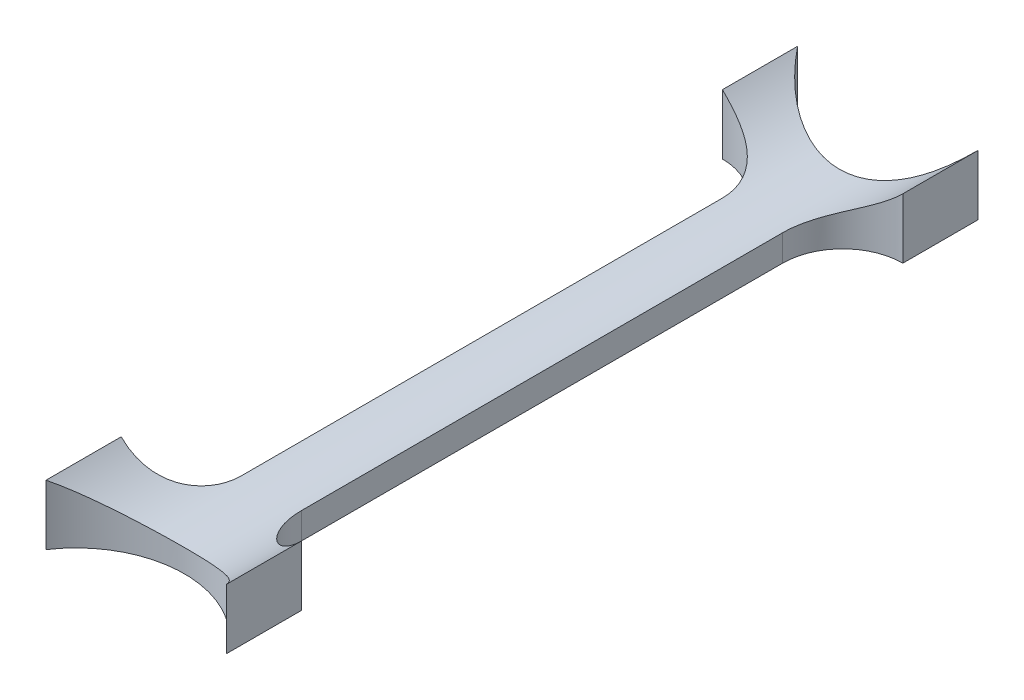
ISO-10303-21;
HEADER;
FILE_DESCRIPTION(('STEP AP214'),'2;1');
FILE_NAME('part.step','',(''),(''),'','','');
FILE_SCHEMA(('AUTOMOTIVE_DESIGN { 1 0 10303 214 1 1 1 1 }'));
ENDSEC;
DATA;
#1=APPLICATION_CONTEXT('core data for automotive mechanical design processes');
#2=APPLICATION_PROTOCOL_DEFINITION('international standard','automotive_design',2000,#1);
#3=PRODUCT_CONTEXT('',#1,'mechanical');
#4=PRODUCT('Part','Part','',(#3));
#5=PRODUCT_RELATED_PRODUCT_CATEGORY('part','',(#4));
#6=PRODUCT_DEFINITION_FORMATION('','',#4);
#7=PRODUCT_DEFINITION_CONTEXT('part definition',#1,'design');
#8=PRODUCT_DEFINITION('design','',#6,#7);
#9=PRODUCT_DEFINITION_SHAPE('','',#8);
#10=(LENGTH_UNIT() NAMED_UNIT(*) SI_UNIT(.MILLI.,.METRE.));
#11=(NAMED_UNIT(*) PLANE_ANGLE_UNIT() SI_UNIT($,.RADIAN.));
#12=(NAMED_UNIT(*) SI_UNIT($,.STERADIAN.) SOLID_ANGLE_UNIT());
#13=UNCERTAINTY_MEASURE_WITH_UNIT(LENGTH_MEASURE(1.E-05),#10,'distance_accuracy_value','');
#14=(GEOMETRIC_REPRESENTATION_CONTEXT(3) GLOBAL_UNCERTAINTY_ASSIGNED_CONTEXT((#13)) GLOBAL_UNIT_ASSIGNED_CONTEXT((#10,
#11,#12)) REPRESENTATION_CONTEXT('',''));
#15=CARTESIAN_POINT('',(0.,0.,0.));
#16=DIRECTION('',(0.,0.,1.));
#17=DIRECTION('',(1.,0.,0.));
#18=AXIS2_PLACEMENT_3D('',#15,#16,#17);
#19=CARTESIAN_POINT('',(0.,10.,72.4999999999999));
#20=DIRECTION('',(0.,-1.,0.));
#21=DIRECTION('',(0.,0.,-1.));
#22=AXIS2_PLACEMENT_3D('',#19,#20,#21);
#23=CYLINDRICAL_SURFACE('',#22,18.0277563773199);
#24=DIRECTION('',(0.,-1.,0.));
#25=VECTOR('',#24,1.);
#26=CARTESIAN_POINT('',(15.,10.,62.5));
#27=LINE('',#26,#25);
#28=CARTESIAN_POINT('',(15.,10.,62.5));
#29=VERTEX_POINT('',#28);
#30=CARTESIAN_POINT('',(15.,0.,62.5));
#31=VERTEX_POINT('',#30);
#32=EDGE_CURVE('E11',#29,#31,#27,.T.);
#33=ORIENTED_EDGE('',*,*,#32,.F.);
#34=CARTESIAN_POINT('',(15.,10.0000000000001,62.4999999999999));
#35=CARTESIAN_POINT('',(14.8538122564849,9.85380413927755,62.2807379878146));
#36=CARTESIAN_POINT('',(14.7029530143159,9.70722716261272,62.064847365456));
#37=CARTESIAN_POINT('',(14.3918877210769,9.41413551974458,61.6398422916655));
#38=CARTESIAN_POINT('',(14.2316811865237,9.26762085715996,61.4307281916172));
#39=CARTESIAN_POINT('',(13.9017278512085,8.97531227531786,61.0190767772544));
#40=CARTESIAN_POINT('',(13.7319694480602,8.82951947729172,60.8165479542715));
#41=CARTESIAN_POINT('',(13.3830971970355,8.53961843121481,60.4184954744921));
#42=CARTESIAN_POINT('',(13.2039834739119,8.39551016073229,60.2229717243419));
#43=CARTESIAN_POINT('',(12.6492620449402,7.96424982710555,59.6437252609932));
#44=CARTESIAN_POINT('',(12.2591722953751,7.68075854553667,59.270953322517));
#45=CARTESIAN_POINT('',(11.4409021588635,7.12966244429384,58.5572511710102));
#46=CARTESIAN_POINT('',(11.0127426844714,6.86204903562067,58.216303684527));
#47=CARTESIAN_POINT('',(10.2157817183783,6.40428397178129,57.639843567146));
#48=CARTESIAN_POINT('',(9.85430584667956,6.2099384539669,57.3975215085808));
#49=CARTESIAN_POINT('',(9.10864141577833,5.837372166692,56.9364283524844));
#50=CARTESIAN_POINT('',(8.72445316377304,5.65915117922095,56.7176569365309));
#51=CARTESIAN_POINT('',(7.9357087555652,5.32240437427608,56.3067428775596));
#52=CARTESIAN_POINT('',(7.53122728922545,5.16381285186149,56.1145111353261));
#53=CARTESIAN_POINT('',(6.70225837838313,4.86860170963907,55.7583416016792));
#54=CARTESIAN_POINT('',(6.27777411760969,4.73197860841615,55.5943993268298));
#55=CARTESIAN_POINT('',(5.47555326492917,4.50205800257936,55.3194756106261));
#56=CARTESIAN_POINT('',(5.10025032923467,4.40533898433433,55.2042439885879));
#57=CARTESIAN_POINT('',(4.33866847318943,4.2315517049285,54.9976696868578));
#58=CARTESIAN_POINT('',(3.95239058653091,4.15448159987982,54.9063247655761));
#59=CARTESIAN_POINT('',(3.17107571026853,4.02140779489103,54.7488562658861));
#60=CARTESIAN_POINT('',(2.77603745740434,3.9654071543996,54.6827363503236));
#61=CARTESIAN_POINT('',(1.97992934674089,3.87559879026633,54.5767994702944));
#62=CARTESIAN_POINT('',(1.57885941630988,3.84179133408773,54.536982822824));
#63=CARTESIAN_POINT('',(0.77270065832343,3.79702164151102,54.4842711439706));
#64=CARTESIAN_POINT('',(0.367604473815429,3.78611466798966,54.4714412361838));
#65=CARTESIAN_POINT('',(-0.442489980262146,3.78754454988629,54.473123775996));
#66=CARTESIAN_POINT('',(-0.847488249773488,3.7998814190943,54.4876362398165));
#67=CARTESIAN_POINT('',(-1.65422725750526,3.84753401334125,54.5437466119855));
#68=CARTESIAN_POINT('',(-2.05596802040053,3.88284956415713,54.5853443149751));
#69=CARTESIAN_POINT('',(-2.85321266721823,3.97572254147166,54.6949140149562));
#70=CARTESIAN_POINT('',(-3.24871657622131,4.03327987850427,54.7628859058593));
#71=CARTESIAN_POINT('',(-4.01620788650184,4.16694633052809,54.9210965969079));
#72=CARTESIAN_POINT('',(-4.38852217373119,4.24228331219802,55.0104101853058));
#73=CARTESIAN_POINT('',(-5.12283285610097,4.41120383005804,55.2112326727065));
#74=CARTESIAN_POINT('',(-5.48482976496761,4.50478645592952,55.3227404643934));
#75=CARTESIAN_POINT('',(-6.19693417926346,4.70874040364197,55.5666103016444));
#76=CARTESIAN_POINT('',(-6.54703913531731,4.81911529793729,55.6989767849849));
#77=CARTESIAN_POINT('',(-7.23402672218851,5.05505481834684,55.9831267649931));
#78=CARTESIAN_POINT('',(-7.57090673938853,5.1806224271493,56.1349140747645));
#79=CARTESIAN_POINT('',(-8.35537700345522,5.49544673050785,56.5174004680671));
#80=CARTESIAN_POINT('',(-8.79658483933098,5.69081541846888,56.7562162679381));
#81=CARTESIAN_POINT('',(-9.6503731864135,6.10303665062741,57.2646013715228));
#82=CARTESIAN_POINT('',(-10.0629431144613,6.31989706598917,57.5341819480951));
#83=CARTESIAN_POINT('',(-10.8593151899836,6.77130847649835,58.1015692365795));
#84=CARTESIAN_POINT('',(-11.2430574031706,7.00589439903344,58.3994319900352));
#85=CARTESIAN_POINT('',(-11.9804738933594,7.48822448043919,59.0203650716798));
#86=CARTESIAN_POINT('',(-12.3341552705268,7.73596550957652,59.3434294126585));
#87=CARTESIAN_POINT('',(-12.8924105770748,8.15183176973899,59.8951963156356));
#88=CARTESIAN_POINT('',(-13.1056955360345,8.31733098947356,60.1171489046546));
#89=CARTESIAN_POINT('',(-13.5196676684846,8.65101700463634,60.5705078467735));
#90=CARTESIAN_POINT('',(-13.7203569425386,8.81920334603657,60.801912612865));
#91=CARTESIAN_POINT('',(-14.1080355032383,9.15610966725116,61.272543195341));
#92=CARTESIAN_POINT('',(-14.2950990329326,9.3248205550738,61.5117144401731));
#93=CARTESIAN_POINT('',(-14.6568430491004,9.66251993701858,61.9991010787654));
#94=CARTESIAN_POINT('',(-14.83152241106,9.8315084549284,62.2473172907413));
#95=CARTESIAN_POINT('',(-15.,9.99999999999998,62.5));
#96=B_SPLINE_CURVE_WITH_KNOTS('',3,(#34,#35,#36,#37,#38,#39,#40,#41,#42,#43,#44,#45,#46,#47,#48,
#49,#50,#51,#52,#53,#54,#55,#56,#57,#58,#59,#60,#61,#62,#63,#64,#65,#66,#67,#68,#69,#70,#71,#72,
#73,#74,#75,#76,#77,#78,#79,#80,#81,#82,#83,#84,#85,#86,#87,#88,#89,#90,#91,#92,#93,#94,#95),
.UNSPECIFIED.,.F.,.F.,(4,2,2,2,2,2,2,2,2,2,2,2,2,2,2,2,2,2,2,2,2,2,2,2,2,2,2,2,2,2,4),(0.,
0.904031153698707,1.80810910941549,2.71330997985651,3.61849878256154,5.44478737339754,
7.27007886877889,8.69863769703833,10.1271772076851,11.5507977040016,12.9741923712102,
14.1859466921669,15.3975872581179,16.6094036957771,17.8212347374869,19.0359867944751,
20.2507395721478,21.4654831397413,22.6802218211643,23.8496468652845,25.0190135789303,
26.1886294171073,27.3584752521918,28.9713025724078,30.5847227754165,32.201409504342,
33.8177133154998,34.8658521009641,35.9138156228569,36.9555592268466,37.9973973029761),.UNSPECIFIED.);
#97=CARTESIAN_POINT('',(-15.,10.,62.5));
#98=VERTEX_POINT('',#97);
#99=EDGE_CURVE('E215',#29,#98,#96,.T.);
#100=ORIENTED_EDGE('',*,*,#99,.T.);
#101=DIRECTION('',(0.,-1.,0.));
#102=VECTOR('',#101,1.);
#103=CARTESIAN_POINT('',(-15.,10.,62.5));
#104=LINE('',#103,#102);
#105=CARTESIAN_POINT('',(-15.,0.,62.5));
#106=VERTEX_POINT('',#105);
#107=EDGE_CURVE('E112',#98,#106,#104,.T.);
#108=ORIENTED_EDGE('',*,*,#107,.T.);
#109=CARTESIAN_POINT('',(0.,0.,72.4999999999999));
#110=DIRECTION('',(0.,-1.,0.));
#111=DIRECTION('',(0.,0.,-1.));
#112=AXIS2_PLACEMENT_3D('',#109,#110,#111);
#113=CIRCLE('',#112,18.0277563773199);
#114=EDGE_CURVE('E117',#106,#31,#113,.T.);
#115=ORIENTED_EDGE('',*,*,#114,.T.);
#116=EDGE_LOOP('',(#33,#100,#108,#115));
#117=FACE_BOUND('',#116,.T.);
#118=ADVANCED_FACE('F33',(#117),#23,.F.);
#119=CARTESIAN_POINT('',(15.,10.,62.5));
#120=DIRECTION('',(-1.,0.,0.));
#121=DIRECTION('',(0.,0.,1.));
#122=AXIS2_PLACEMENT_3D('',#119,#120,#121);
#123=PLANE('',#122);
#124=DIRECTION('',(0.,0.,-1.));
#125=VECTOR('',#124,1.);
#126=CARTESIAN_POINT('',(15.,0.,62.5));
#127=LINE('',#126,#125);
#128=CARTESIAN_POINT('',(15.0000000000001,0.,50.));
#129=VERTEX_POINT('',#128);
#130=EDGE_CURVE('E159',#31,#129,#127,.T.);
#131=ORIENTED_EDGE('',*,*,#130,.T.);
#132=DIRECTION('',(0.,-1.,0.));
#133=VECTOR('',#132,1.);
#134=CARTESIAN_POINT('',(15.0000000000001,10.,50.));
#135=LINE('',#134,#133);
#136=CARTESIAN_POINT('',(15.,10.,50.));
#137=VERTEX_POINT('',#136);
#138=EDGE_CURVE('E42',#137,#129,#135,.T.);
#139=ORIENTED_EDGE('',*,*,#138,.F.);
#140=DIRECTION('',(0.,0.,-1.));
#141=VECTOR('',#140,1.);
#142=CARTESIAN_POINT('',(15.,10.,62.5));
#143=LINE('',#142,#141);
#144=EDGE_CURVE('E118',#29,#137,#143,.T.);
#145=ORIENTED_EDGE('',*,*,#144,.F.);
#146=ORIENTED_EDGE('',*,*,#32,.T.);
#147=EDGE_LOOP('',(#131,#139,#145,#146));
#148=FACE_BOUND('',#147,.T.);
#149=ADVANCED_FACE('F287',(#148),#123,.F.);
#150=CARTESIAN_POINT('',(15.,10.,40.));
#151=DIRECTION('',(0.,-1.,0.));
#152=DIRECTION('',(0.,0.,-1.));
#153=AXIS2_PLACEMENT_3D('',#150,#151,#152);
#154=CYLINDRICAL_SURFACE('',#153,10.);
#155=DIRECTION('',(0.,-1.,0.));
#156=VECTOR('',#155,1.);
#157=CARTESIAN_POINT('',(5.00000000000004,10.,40.));
#158=LINE('',#157,#156);
#159=CARTESIAN_POINT('',(4.99999999999999,4.38447187191171,40.));
#160=VERTEX_POINT('',#159);
#161=CARTESIAN_POINT('',(5.00000000000004,0.,40.));
#162=VERTEX_POINT('',#161);
#163=EDGE_CURVE('E143',#160,#162,#158,.T.);
#164=ORIENTED_EDGE('',*,*,#163,.F.);
#165=CARTESIAN_POINT('',(5.00000000000005,4.38447187191172,40.));
#166=CARTESIAN_POINT('',(4.99996708617364,4.38450381388134,40.2713867713434));
#167=CARTESIAN_POINT('',(5.01104626026922,4.38715226868355,40.5427720810309));
#168=CARTESIAN_POINT('',(5.05519388377671,4.39791342953872,41.0836405368598));
#169=CARTESIAN_POINT('',(5.08826243166531,4.40602616006276,41.3531236744769));
#170=CARTESIAN_POINT('',(5.17615396943087,4.42794711953936,41.8882865141327));
#171=CARTESIAN_POINT('',(5.23097699451139,4.44175535770852,42.1539662100158));
#172=CARTESIAN_POINT('',(5.36190120343833,4.47551187655505,42.6796270042695));
#173=CARTESIAN_POINT('',(5.43800188627628,4.49546001266214,42.9396082366619));
#174=CARTESIAN_POINT('',(5.61089362825824,4.54209489565838,43.4522333475644));
#175=CARTESIAN_POINT('',(5.7077026496029,4.56878749629272,43.7048706385313));
#176=CARTESIAN_POINT('',(5.92108341511692,4.62960304178338,44.2007285509231));
#177=CARTESIAN_POINT('',(6.03765484270508,4.6637258676147,44.4439493231179));
#178=CARTESIAN_POINT('',(6.28937247895207,4.74016104962172,44.9190649743739));
#179=CARTESIAN_POINT('',(6.42450841041377,4.78246887988268,45.1509660243587));
#180=CARTESIAN_POINT('',(6.71203802382778,4.87609897169499,45.6018909836964));
#181=CARTESIAN_POINT('',(6.86443138356807,4.92742106495164,45.8209151333568));
#182=CARTESIAN_POINT('',(7.18301827446057,5.03922831060876,46.2420922400699));
#183=CARTESIAN_POINT('',(7.34903308813617,5.09960138327718,46.4444101551528));
#184=CARTESIAN_POINT('',(7.69455295738938,5.23063029253532,46.8336048178211));
#185=CARTESIAN_POINT('',(7.87405786303863,5.30128601485224,47.0204817369686));
#186=CARTESIAN_POINT('',(8.24454744698233,5.45345232387735,47.3776737511878));
#187=CARTESIAN_POINT('',(8.43553139723972,5.53496222257733,47.547989894806));
#188=CARTESIAN_POINT('',(8.82683060748106,5.70925294442641,47.8712376572342));
#189=CARTESIAN_POINT('',(9.02714582956561,5.80203372180076,48.0241693466432));
#190=CARTESIAN_POINT('',(9.43336496714879,5.99836491946569,48.3110745195572));
#191=CARTESIAN_POINT('',(9.63921736625434,6.10183171422838,48.4451783349254));
#192=CARTESIAN_POINT('',(10.0556795783514,6.32010241826311,48.6955582600562));
#193=CARTESIAN_POINT('',(10.2662893699484,6.43490627655892,48.8118344499733));
#194=CARTESIAN_POINT('',(10.6901715145471,6.67570843174359,49.0267305224062));
#195=CARTESIAN_POINT('',(10.9034445780721,6.80170977327661,49.1253455806708));
#196=CARTESIAN_POINT('',(11.3305779674189,7.06453535060737,49.3053243522811));
#197=CARTESIAN_POINT('',(11.5444383039773,7.2013597855625,49.3866877480748));
#198=CARTESIAN_POINT('',(11.9852147599991,7.4948766787943,49.5377630727815));
#199=CARTESIAN_POINT('',(12.2120454743213,7.65228610187894,49.6063289345425));
#200=CARTESIAN_POINT('',(12.6623792791545,7.97820716339207,49.7257293727712));
#201=CARTESIAN_POINT('',(12.8858819448567,8.14672020449877,49.7765617039037));
#202=CARTESIAN_POINT('',(13.3278394174312,8.49401103345765,49.8617705592272));
#203=CARTESIAN_POINT('',(13.5462957803667,8.67278559620361,49.8961522223452));
#204=CARTESIAN_POINT('',(13.9768738209006,9.03983087539239,49.9498879665965));
#205=CARTESIAN_POINT('',(14.188997279563,9.22809888107521,49.9692463119036));
#206=CARTESIAN_POINT('',(14.4997784651883,9.51530225286351,49.9880075237368));
#207=CARTESIAN_POINT('',(14.601231867786,9.61093004714313,49.9925523524695));
#208=CARTESIAN_POINT('',(14.8021099798396,9.80404930136512,49.9985456446668));
#209=CARTESIAN_POINT('',(14.9015378560418,9.90153730218301,49.9999993792618));
#210=CARTESIAN_POINT('',(15.,10.,50.));
#211=B_SPLINE_CURVE_WITH_KNOTS('',3,(#165,#166,#167,#168,#169,#170,#171,#172,#173,#174,#175,
#176,#177,#178,#179,#180,#181,#182,#183,#184,#185,#186,#187,#188,#189,#190,#191,#192,#193,#194,
#195,#196,#197,#198,#199,#200,#201,#202,#203,#204,#205,#206,#207,#208,#209,#210),.UNSPECIFIED.,
.F.,.F.,(4,2,2,2,2,2,2,2,2,2,2,2,2,2,2,2,2,2,2,2,2,2,4),(0.,0.813919794009895,1.6278432330836,
2.44176798927082,3.25567358221821,4.07028803214262,4.8848894336934,5.69904168057088,
6.51317872898486,7.317959718412,8.12273176485677,8.9274528238812,9.73217061477813,
10.531009794649,11.3298453827651,12.1288988462248,12.9279670166113,13.780579081375,
14.6332990606711,15.4857524896102,16.3379638721254,16.7563894820991,17.1741009919722),.UNSPECIFIED.);
#212=EDGE_CURVE('E156',#160,#137,#211,.T.);
#213=ORIENTED_EDGE('',*,*,#212,.T.);
#214=ORIENTED_EDGE('',*,*,#138,.T.);
#215=CARTESIAN_POINT('',(15.,0.,40.));
#216=DIRECTION('',(0.,-1.,0.));
#217=DIRECTION('',(0.,0.,-1.));
#218=AXIS2_PLACEMENT_3D('',#215,#216,#217);
#219=CIRCLE('',#218,10.);
#220=EDGE_CURVE('E152',#129,#162,#219,.T.);
#221=ORIENTED_EDGE('',*,*,#220,.T.);
#222=EDGE_LOOP('',(#164,#213,#214,#221));
#223=FACE_BOUND('',#222,.T.);
#224=ADVANCED_FACE('F151',(#223),#154,.F.);
#225=CARTESIAN_POINT('',(5.,10.,-40.));
#226=DIRECTION('',(-1.,0.,0.));
#227=DIRECTION('',(0.,0.,1.));
#228=AXIS2_PLACEMENT_3D('',#225,#226,#227);
#229=PLANE('',#228);
#230=DIRECTION('',(0.,-1.,0.));
#231=VECTOR('',#230,1.);
#232=CARTESIAN_POINT('',(5.00000000000001,10.,-40.));
#233=LINE('',#232,#231);
#234=CARTESIAN_POINT('',(5.00000000000001,4.38447187191171,-40.));
#235=VERTEX_POINT('',#234);
#236=CARTESIAN_POINT('',(5.00000000000001,0.,-40.));
#237=VERTEX_POINT('',#236);
#238=EDGE_CURVE('E141',#235,#237,#233,.T.);
#239=ORIENTED_EDGE('',*,*,#238,.F.);
#240=DIRECTION('',(0.,0.,1.));
#241=VECTOR('',#240,1.);
#242=CARTESIAN_POINT('',(4.99999999999999,4.38447187191171,-62.5));
#243=LINE('',#242,#241);
#244=EDGE_CURVE('E211',#235,#160,#243,.T.);
#245=ORIENTED_EDGE('',*,*,#244,.T.);
#246=ORIENTED_EDGE('',*,*,#163,.T.);
#247=DIRECTION('',(0.,0.,-1.));
#248=VECTOR('',#247,1.);
#249=CARTESIAN_POINT('',(5.,0.,-40.));
#250=LINE('',#249,#248);
#251=EDGE_CURVE('E162',#162,#237,#250,.T.);
#252=ORIENTED_EDGE('',*,*,#251,.T.);
#253=EDGE_LOOP('',(#239,#245,#246,#252));
#254=FACE_BOUND('',#253,.T.);
#255=ADVANCED_FACE('F219',(#254),#229,.F.);
#256=CARTESIAN_POINT('',(15.,10.,-40.));
#257=DIRECTION('',(0.,-1.,0.));
#258=DIRECTION('',(0.,0.,-1.));
#259=AXIS2_PLACEMENT_3D('',#256,#257,#258);
#260=CYLINDRICAL_SURFACE('',#259,10.);
#261=DIRECTION('',(0.,-1.,0.));
#262=VECTOR('',#261,1.);
#263=CARTESIAN_POINT('',(15.,10.,-50.));
#264=LINE('',#263,#262);
#265=CARTESIAN_POINT('',(15.,10.,-50.));
#266=VERTEX_POINT('',#265);
#267=CARTESIAN_POINT('',(15.,0.,-50.));
#268=VERTEX_POINT('',#267);
#269=EDGE_CURVE('E138',#266,#268,#264,.T.);
#270=ORIENTED_EDGE('',*,*,#269,.F.);
#271=CARTESIAN_POINT('',(15.,10.,-50.));
#272=CARTESIAN_POINT('',(14.8797314433977,9.87973015464746,-49.999998561285));
#273=CARTESIAN_POINT('',(14.7580219753821,9.76091572472623,-49.9978299481283));
#274=CARTESIAN_POINT('',(14.5118555730855,9.52631383203486,-49.9888386389638));
#275=CARTESIAN_POINT('',(14.3873982359313,9.41052681863195,-49.982015256063));
#276=CARTESIAN_POINT('',(14.0098544236561,9.0676563404644,-49.9540614785229));
#277=CARTESIAN_POINT('',(13.752889140889,8.84535636037998,-49.9254458911245));
#278=CARTESIAN_POINT('',(13.2293760299073,8.41388358033631,-49.8455752825216));
#279=CARTESIAN_POINT('',(12.9627871627448,8.20478099277699,-49.7942092095339));
#280=CARTESIAN_POINT('',(12.4239150996396,7.8023469840967,-49.6664558392975));
#281=CARTESIAN_POINT('',(12.1516354596877,7.60900606354636,-49.5900837543133));
#282=CARTESIAN_POINT('',(11.6510927184501,7.27072546918752,-49.4255996605367));
#283=CARTESIAN_POINT('',(11.4232239521581,7.12314808928726,-49.3416970060173));
#284=CARTESIAN_POINT('',(10.9678705494272,6.84021934021782,-49.1543716875161));
#285=CARTESIAN_POINT('',(10.7403859157828,6.70486805961712,-49.0509488821428));
#286=CARTESIAN_POINT('',(10.2888501978537,6.44718452255065,-48.8243244244435));
#287=CARTESIAN_POINT('',(10.0647915224676,6.32481821901237,-48.701176734384));
#288=CARTESIAN_POINT('',(9.62207026094449,6.09290573065532,-48.4347265137091));
#289=CARTESIAN_POINT('',(9.40340760033425,5.98335936882347,-48.2914242614407));
#290=CARTESIAN_POINT('',(8.97318419645049,5.77659780732701,-47.9842134549234));
#291=CARTESIAN_POINT('',(8.76165951826049,5.67943984394321,-47.8202157595892));
#292=CARTESIAN_POINT('',(8.34941584169622,5.49774341085391,-47.4727768064083));
#293=CARTESIAN_POINT('',(8.14869708816668,5.41320522701527,-47.2893351082714));
#294=CARTESIAN_POINT('',(7.76047012375383,5.25616550422677,-46.9039179150659));
#295=CARTESIAN_POINT('',(7.57297209157719,5.18367318244101,-46.701928409529));
#296=CARTESIAN_POINT('',(7.21369815403576,5.05008003647627,-46.2809294339896));
#297=CARTESIAN_POINT('',(7.04192150611735,4.98897867413712,-46.0619207687416));
#298=CARTESIAN_POINT('',(6.72635170341378,4.88079871196511,-45.6227421799693));
#299=CARTESIAN_POINT('',(6.58148007014161,4.83308186325307,-45.4035025907162));
#300=CARTESIAN_POINT('',(6.3088221280467,4.74613005387466,-44.9530528758003));
#301=CARTESIAN_POINT('',(6.18103523659702,4.70689480393912,-44.7218431587181));
#302=CARTESIAN_POINT('',(5.94377921324161,4.63613931620033,-44.2490955628935));
#303=CARTESIAN_POINT('',(5.83430926881513,4.60461873615362,-44.0075581428742));
#304=CARTESIAN_POINT('',(5.63467971310876,4.54856631149909,-43.5158473790918));
#305=CARTESIAN_POINT('',(5.54452004694096,4.52403444702635,-43.2656740598778));
#306=CARTESIAN_POINT('',(5.38778119319436,4.4822489360734,-42.7694727392299));
#307=CARTESIAN_POINT('',(5.32034793374335,4.4647254586791,-42.5237366056908));
#308=CARTESIAN_POINT('',(5.20438656024873,4.43503167292382,-42.0275306321482));
#309=CARTESIAN_POINT('',(5.15585800524816,4.42286123970089,-41.7770609026999));
#310=CARTESIAN_POINT('',(5.07807514343597,4.40352327283134,-41.27295569213));
#311=CARTESIAN_POINT('',(5.04882099779871,4.39635578101975,-41.0193201845539));
#312=CARTESIAN_POINT('',(5.00977027773155,4.38684252841915,-40.5104569539224));
#313=CARTESIAN_POINT('',(4.99997438724954,4.38449693711741,-40.2552291752158));
#314=CARTESIAN_POINT('',(5.00000000000001,4.38447187191171,-40.));
#315=B_SPLINE_CURVE_WITH_KNOTS('',3,(#271,#272,#273,#274,#275,#276,#277,#278,#279,#280,#281,
#282,#283,#284,#285,#286,#287,#288,#289,#290,#291,#292,#293,#294,#295,#296,#297,#298,#299,#300,
#301,#302,#303,#304,#305,#306,#307,#308,#309,#310,#311,#312,#313,#314),.UNSPECIFIED.,.F.,.F.,(4,
2,2,2,2,2,2,2,2,2,2,2,2,2,2,2,2,2,2,2,2,4),(0.,0.510207556488812,1.02049041935187,
2.04229598218807,3.06914521067997,4.09537091835182,4.94696375195937,5.79856275419348,
6.64787058698844,7.49716669146727,8.3502545010899,9.20336163217063,10.057118561191,
10.9108351446656,11.7111270813227,12.5113917193159,13.3116208489848,14.1118477040371,
14.8773193000785,15.6427730402342,16.408233181102,17.1737202270323),.UNSPECIFIED.);
#316=EDGE_CURVE('E220',#266,#235,#315,.T.);
#317=ORIENTED_EDGE('',*,*,#316,.T.);
#318=ORIENTED_EDGE('',*,*,#238,.T.);
#319=CARTESIAN_POINT('',(15.,0.,-40.));
#320=DIRECTION('',(0.,-1.,0.));
#321=DIRECTION('',(0.,0.,1.));
#322=AXIS2_PLACEMENT_3D('',#319,#320,#321);
#323=CIRCLE('',#322,10.);
#324=EDGE_CURVE('E164',#237,#268,#323,.T.);
#325=ORIENTED_EDGE('',*,*,#324,.T.);
#326=EDGE_LOOP('',(#270,#317,#318,#325));
#327=FACE_BOUND('',#326,.T.);
#328=ADVANCED_FACE('F278',(#327),#260,.F.);
#329=CARTESIAN_POINT('',(15.,10.,-62.5));
#330=DIRECTION('',(-1.,0.,0.));
#331=DIRECTION('',(0.,0.,1.));
#332=AXIS2_PLACEMENT_3D('',#329,#330,#331);
#333=PLANE('',#332);
#334=DIRECTION('',(0.,0.,-1.));
#335=VECTOR('',#334,1.);
#336=CARTESIAN_POINT('',(15.,0.,-62.5));
#337=LINE('',#336,#335);
#338=CARTESIAN_POINT('',(15.,0.,-62.5));
#339=VERTEX_POINT('',#338);
#340=EDGE_CURVE('E170',#268,#339,#337,.T.);
#341=ORIENTED_EDGE('',*,*,#340,.T.);
#342=DIRECTION('',(0.,-1.,0.));
#343=VECTOR('',#342,1.);
#344=CARTESIAN_POINT('',(15.,10.,-62.5));
#345=LINE('',#344,#343);
#346=CARTESIAN_POINT('',(15.,10.,-62.5));
#347=VERTEX_POINT('',#346);
#348=EDGE_CURVE('E135',#347,#339,#345,.T.);
#349=ORIENTED_EDGE('',*,*,#348,.F.);
#350=DIRECTION('',(0.,0.,-1.));
#351=VECTOR('',#350,1.);
#352=CARTESIAN_POINT('',(15.,10.,-62.5));
#353=LINE('',#352,#351);
#354=EDGE_CURVE('E121',#266,#347,#353,.T.);
#355=ORIENTED_EDGE('',*,*,#354,.F.);
#356=ORIENTED_EDGE('',*,*,#269,.T.);
#357=EDGE_LOOP('',(#341,#349,#355,#356));
#358=FACE_BOUND('',#357,.T.);
#359=ADVANCED_FACE('F275',(#358),#333,.F.);
#360=CARTESIAN_POINT('',(0.,10.,-72.5));
#361=DIRECTION('',(0.,-1.,0.));
#362=DIRECTION('',(0.,0.,-1.));
#363=AXIS2_PLACEMENT_3D('',#360,#361,#362);
#364=CYLINDRICAL_SURFACE('',#363,18.0277563773199);
#365=DIRECTION('',(0.,-1.,0.));
#366=VECTOR('',#365,1.);
#367=CARTESIAN_POINT('',(-15.,10.,-62.5));
#368=LINE('',#367,#366);
#369=CARTESIAN_POINT('',(-15.,10.,-62.5));
#370=VERTEX_POINT('',#369);
#371=CARTESIAN_POINT('',(-15.,0.,-62.5));
#372=VERTEX_POINT('',#371);
#373=EDGE_CURVE('E132',#370,#372,#368,.T.);
#374=ORIENTED_EDGE('',*,*,#373,.F.);
#375=CARTESIAN_POINT('',(-15.,10.,-62.5));
#376=CARTESIAN_POINT('',(-14.8538122564849,9.85380413927751,-62.2807379878147));
#377=CARTESIAN_POINT('',(-14.7029530143159,9.70722716261268,-62.064847365456));
#378=CARTESIAN_POINT('',(-14.3918877210769,9.41413551974454,-61.6398422916656));
#379=CARTESIAN_POINT('',(-14.2316811865236,9.26762085715993,-61.4307281916172));
#380=CARTESIAN_POINT('',(-13.9017278512085,8.97531227531783,-61.0190767772545));
#381=CARTESIAN_POINT('',(-13.7319694480602,8.82951947729169,-60.8165479542715));
#382=CARTESIAN_POINT('',(-13.3830971970355,8.53961843121478,-60.4184954744922));
#383=CARTESIAN_POINT('',(-13.2039834739118,8.39551016073227,-60.222971724342));
#384=CARTESIAN_POINT('',(-12.6492620449402,7.96424982710552,-59.6437252609932));
#385=CARTESIAN_POINT('',(-12.259172295375,7.68075854553664,-59.2709533225171));
#386=CARTESIAN_POINT('',(-11.4409021588634,7.12966244429382,-58.5572511710103));
#387=CARTESIAN_POINT('',(-11.0127426844713,6.86204903562065,-58.2163036845271));
#388=CARTESIAN_POINT('',(-10.2157817183782,6.40428397178128,-57.6398435671461));
#389=CARTESIAN_POINT('',(-9.85430584667953,6.20993845396688,-57.3975215085808));
#390=CARTESIAN_POINT('',(-9.1086414157783,5.83737216669198,-56.9364283524844));
#391=CARTESIAN_POINT('',(-8.72445316377301,5.65915117922094,-56.7176569365309));
#392=CARTESIAN_POINT('',(-7.93570875556517,5.32240437427607,-56.3067428775597));
#393=CARTESIAN_POINT('',(-7.53122728922543,5.16381285186147,-56.1145111353261));
#394=CARTESIAN_POINT('',(-6.7022583783831,4.86860170963906,-55.7583416016792));
#395=CARTESIAN_POINT('',(-6.27777411760966,4.73197860841615,-55.5943993268299));
#396=CARTESIAN_POINT('',(-5.47555326492913,4.50205800257936,-55.3194756106261));
#397=CARTESIAN_POINT('',(-5.10025032923463,4.40533898433432,-55.2042439885879));
#398=CARTESIAN_POINT('',(-4.33866847318939,4.23155170492849,-54.9976696868578));
#399=CARTESIAN_POINT('',(-3.95239058653087,4.15448159987981,-54.9063247655761));
#400=CARTESIAN_POINT('',(-3.17107571026849,4.02140779489103,-54.7488562658861));
#401=CARTESIAN_POINT('',(-2.7760374574043,3.96540715439959,-54.6827363503237));
#402=CARTESIAN_POINT('',(-1.97992934674084,3.87559879026632,-54.5767994702945));
#403=CARTESIAN_POINT('',(-1.57885941630984,3.84179133408772,-54.536982822824));
#404=CARTESIAN_POINT('',(-0.772700658323389,3.79702164151101,-54.4842711439707));
#405=CARTESIAN_POINT('',(-0.367604473815387,3.78611466798966,-54.4714412361839));
#406=CARTESIAN_POINT('',(0.442489980262189,3.78754454988629,-54.473123775996));
#407=CARTESIAN_POINT('',(0.84748824977353,3.7998814190943,-54.4876362398165));
#408=CARTESIAN_POINT('',(1.6542272575053,3.84753401334125,-54.5437466119855));
#409=CARTESIAN_POINT('',(2.05596802040057,3.88284956415714,-54.5853443149752));
#410=CARTESIAN_POINT('',(2.85321266721828,3.97572254147166,-54.6949140149562));
#411=CARTESIAN_POINT('',(3.24871657622136,4.03327987850427,-54.7628859058593));
#412=CARTESIAN_POINT('',(4.01620788650189,4.1669463305281,-54.9210965969079));
#413=CARTESIAN_POINT('',(4.38852217373124,4.24228331219803,-55.0104101853058));
#414=CARTESIAN_POINT('',(5.12283285610102,4.41120383005805,-55.2112326727065));
#415=CARTESIAN_POINT('',(5.48482976496765,4.50478645592953,-55.3227404643934));
#416=CARTESIAN_POINT('',(6.19693417926351,4.70874040364199,-55.5666103016445));
#417=CARTESIAN_POINT('',(6.54703913531736,4.81911529793731,-55.6989767849849));
#418=CARTESIAN_POINT('',(7.23402672218856,5.05505481834686,-55.9831267649932));
#419=CARTESIAN_POINT('',(7.57090673938858,5.18062242714931,-56.1349140747646));
#420=CARTESIAN_POINT('',(8.35537700345527,5.49544673050787,-56.5174004680671));
#421=CARTESIAN_POINT('',(8.79658483933103,5.6908154184689,-56.7562162679381));
#422=CARTESIAN_POINT('',(9.65037318641355,6.10303665062743,-57.2646013715228));
#423=CARTESIAN_POINT('',(10.0629431144614,6.31989706598919,-57.5341819480951));
#424=CARTESIAN_POINT('',(10.8593151899837,6.77130847649838,-58.1015692365795));
#425=CARTESIAN_POINT('',(11.2430574031706,7.00589439903348,-58.3994319900353));
#426=CARTESIAN_POINT('',(11.9804738933595,7.48822448043923,-59.0203650716798));
#427=CARTESIAN_POINT('',(12.3341552705269,7.73596550957656,-59.3434294126585));
#428=CARTESIAN_POINT('',(12.8924105770748,8.15183176973903,-59.8951963156356));
#429=CARTESIAN_POINT('',(13.1056955360346,8.3173309894736,-60.1171489046546));
#430=CARTESIAN_POINT('',(13.5196676684847,8.65101700463637,-60.5705078467735));
#431=CARTESIAN_POINT('',(13.7203569425386,8.81920334603661,-60.801912612865));
#432=CARTESIAN_POINT('',(14.1080355032383,9.15610966725119,-61.272543195341));
#433=CARTESIAN_POINT('',(14.2950990329326,9.32482055507383,-61.5117144401731));
#434=CARTESIAN_POINT('',(14.6568430491004,9.66251993701861,-61.9991010787654));
#435=CARTESIAN_POINT('',(14.83152241106,9.83150845492843,-62.2473172907413));
#436=CARTESIAN_POINT('',(15.,10.,-62.5));
#437=B_SPLINE_CURVE_WITH_KNOTS('',3,(#375,#376,#377,#378,#379,#380,#381,#382,#383,#384,#385,
#386,#387,#388,#389,#390,#391,#392,#393,#394,#395,#396,#397,#398,#399,#400,#401,#402,#403,#404,
#405,#406,#407,#408,#409,#410,#411,#412,#413,#414,#415,#416,#417,#418,#419,#420,#421,#422,#423,
#424,#425,#426,#427,#428,#429,#430,#431,#432,#433,#434,#435,#436),.UNSPECIFIED.,.F.,.F.,(4,2,2,
2,2,2,2,2,2,2,2,2,2,2,2,2,2,2,2,2,2,2,2,2,2,2,2,2,2,2,4),(0.,0.904031153698712,1.80810910941549,
2.7133099798565,3.61849878256154,5.44478737339753,7.27007886877887,8.69863769703831,
10.1271772076851,11.5507977040016,12.9741923712102,14.1859466921669,15.3975872581179,
16.6094036957771,17.8212347374869,19.0359867944751,20.2507395721478,21.4654831397413,
22.6802218211643,23.8496468652845,25.0190135789303,26.1886294171073,27.3584752521918,
28.9713025724078,30.5847227754165,32.201409504342,33.8177133154998,34.8658521009641,
35.9138156228569,36.9555592268466,37.997397302976),.UNSPECIFIED.);
#438=EDGE_CURVE('E49',#370,#347,#437,.T.);
#439=ORIENTED_EDGE('',*,*,#438,.T.);
#440=ORIENTED_EDGE('',*,*,#348,.T.);
#441=CARTESIAN_POINT('',(0.,0.,-72.5));
#442=DIRECTION('',(0.,-1.,0.));
#443=DIRECTION('',(0.,0.,1.));
#444=AXIS2_PLACEMENT_3D('',#441,#442,#443);
#445=CIRCLE('',#444,18.0277563773199);
#446=EDGE_CURVE('E172',#339,#372,#445,.T.);
#447=ORIENTED_EDGE('',*,*,#446,.T.);
#448=EDGE_LOOP('',(#374,#439,#440,#447));
#449=FACE_BOUND('',#448,.T.);
#450=ADVANCED_FACE('F270',(#449),#364,.F.);
#451=CARTESIAN_POINT('',(-15.,10.,-62.5));
#452=DIRECTION('',(1.,0.,0.));
#453=DIRECTION('',(0.,0.,-1.));
#454=AXIS2_PLACEMENT_3D('',#451,#452,#453);
#455=PLANE('',#454);
#456=DIRECTION('',(0.,0.,1.));
#457=VECTOR('',#456,1.);
#458=CARTESIAN_POINT('',(-15.,0.,-62.5));
#459=LINE('',#458,#457);
#460=CARTESIAN_POINT('',(-15.,0.,-50.));
#461=VERTEX_POINT('',#460);
#462=EDGE_CURVE('E174',#372,#461,#459,.T.);
#463=ORIENTED_EDGE('',*,*,#462,.T.);
#464=DIRECTION('',(0.,-1.,0.));
#465=VECTOR('',#464,1.);
#466=CARTESIAN_POINT('',(-15.,10.,-50.));
#467=LINE('',#466,#465);
#468=CARTESIAN_POINT('',(-15.,10.,-50.));
#469=VERTEX_POINT('',#468);
#470=EDGE_CURVE('E129',#469,#461,#467,.T.);
#471=ORIENTED_EDGE('',*,*,#470,.F.);
#472=DIRECTION('',(0.,0.,1.));
#473=VECTOR('',#472,1.);
#474=CARTESIAN_POINT('',(-15.,10.,-62.5));
#475=LINE('',#474,#473);
#476=EDGE_CURVE('E197',#370,#469,#475,.T.);
#477=ORIENTED_EDGE('',*,*,#476,.F.);
#478=ORIENTED_EDGE('',*,*,#373,.T.);
#479=EDGE_LOOP('',(#463,#471,#477,#478));
#480=FACE_BOUND('',#479,.T.);
#481=ADVANCED_FACE('F196',(#480),#455,.F.);
#482=CARTESIAN_POINT('',(-15.,10.,-40.));
#483=DIRECTION('',(0.,-1.,0.));
#484=DIRECTION('',(0.,0.,-1.));
#485=AXIS2_PLACEMENT_3D('',#482,#483,#484);
#486=CYLINDRICAL_SURFACE('',#485,10.);
#487=DIRECTION('',(0.,-1.,0.));
#488=VECTOR('',#487,1.);
#489=CARTESIAN_POINT('',(-5.,10.,-40.));
#490=LINE('',#489,#488);
#491=CARTESIAN_POINT('',(-5.00000000000001,4.38447187191171,-40.));
#492=VERTEX_POINT('',#491);
#493=CARTESIAN_POINT('',(-5.,0.,-40.));
#494=VERTEX_POINT('',#493);
#495=EDGE_CURVE('E127',#492,#494,#490,.T.);
#496=ORIENTED_EDGE('',*,*,#495,.F.);
#497=CARTESIAN_POINT('',(-5.,4.38447187191171,-40.));
#498=CARTESIAN_POINT('',(-4.99996708617359,4.38450381388133,-40.2713867713434));
#499=CARTESIAN_POINT('',(-5.01104626026918,4.38715226868354,-40.542772081031));
#500=CARTESIAN_POINT('',(-5.05519388377667,4.39791342953871,-41.0836405368598));
#501=CARTESIAN_POINT('',(-5.08826243166526,4.40602616006275,-41.3531236744769));
#502=CARTESIAN_POINT('',(-5.17615396943082,4.42794711953935,-41.8882865141328));
#503=CARTESIAN_POINT('',(-5.23097699451134,4.4417553577085,-42.1539662100159));
#504=CARTESIAN_POINT('',(-5.36190120343828,4.47551187655504,-42.6796270042695));
#505=CARTESIAN_POINT('',(-5.43800188627623,4.49546001266213,-42.9396082366619));
#506=CARTESIAN_POINT('',(-5.61089362825819,4.54209489565837,-43.4522333475644));
#507=CARTESIAN_POINT('',(-5.70770264960285,4.56878749629271,-43.7048706385313));
#508=CARTESIAN_POINT('',(-5.92108341511687,4.62960304178337,-44.2007285509231));
#509=CARTESIAN_POINT('',(-6.03765484270503,4.66372586761468,-44.443949323118));
#510=CARTESIAN_POINT('',(-6.28937247895203,4.74016104962171,-44.919064974374));
#511=CARTESIAN_POINT('',(-6.42450841041373,4.78246887988266,-45.1509660243588));
#512=CARTESIAN_POINT('',(-6.71203802382773,4.87609897169497,-45.6018909836964));
#513=CARTESIAN_POINT('',(-6.86443138356802,4.92742106495162,-45.8209151333568));
#514=CARTESIAN_POINT('',(-7.18301827446053,5.03922831060874,-46.2420922400699));
#515=CARTESIAN_POINT('',(-7.34903308813612,5.09960138327716,-46.4444101551529));
#516=CARTESIAN_POINT('',(-7.69455295738933,5.2306302925353,-46.8336048178212));
#517=CARTESIAN_POINT('',(-7.87405786303858,5.30128601485222,-47.0204817369687));
#518=CARTESIAN_POINT('',(-8.24454744698227,5.45345232387733,-47.3776737511878));
#519=CARTESIAN_POINT('',(-8.43553139723967,5.53496222257731,-47.5479898948061));
#520=CARTESIAN_POINT('',(-8.82683060748102,5.70925294442639,-47.8712376572342));
#521=CARTESIAN_POINT('',(-9.02714582956557,5.80203372180074,-48.0241693466432));
#522=CARTESIAN_POINT('',(-9.43336496714875,5.99836491946566,-48.3110745195572));
#523=CARTESIAN_POINT('',(-9.63921736625431,6.10183171422836,-48.4451783349255));
#524=CARTESIAN_POINT('',(-10.0556795783514,6.32010241826309,-48.6955582600563));
#525=CARTESIAN_POINT('',(-10.2662893699484,6.4349062765589,-48.8118344499734));
#526=CARTESIAN_POINT('',(-10.6901715145471,6.67570843174357,-49.0267305224063));
#527=CARTESIAN_POINT('',(-10.903444578072,6.80170977327659,-49.1253455806709));
#528=CARTESIAN_POINT('',(-11.3305779674189,7.06453535060734,-49.3053243522812));
#529=CARTESIAN_POINT('',(-11.5444383039773,7.20135978556247,-49.3866877480749));
#530=CARTESIAN_POINT('',(-11.985214759999,7.49487667879427,-49.5377630727816));
#531=CARTESIAN_POINT('',(-12.2120454743212,7.65228610187892,-49.6063289345425));
#532=CARTESIAN_POINT('',(-12.6623792791545,7.97820716339204,-49.7257293727712));
#533=CARTESIAN_POINT('',(-12.8858819448567,8.14672020449874,-49.7765617039038));
#534=CARTESIAN_POINT('',(-13.3278394174311,8.49401103345762,-49.8617705592272));
#535=CARTESIAN_POINT('',(-13.5462957803666,8.67278559620357,-49.8961522223452));
#536=CARTESIAN_POINT('',(-13.9768738209005,9.03983087539235,-49.9498879665966));
#537=CARTESIAN_POINT('',(-14.188997279563,9.22809888107517,-49.9692463119037));
#538=CARTESIAN_POINT('',(-14.4997784651882,9.51530225286348,-49.9880075237369));
#539=CARTESIAN_POINT('',(-14.601231867786,9.61093004714311,-49.9925523524695));
#540=CARTESIAN_POINT('',(-14.8021099798396,9.80404930136511,-49.9985456446668));
#541=CARTESIAN_POINT('',(-14.9015378560418,9.90153730218301,-49.9999993792619));
#542=CARTESIAN_POINT('',(-15.,10.,-50.));
#543=B_SPLINE_CURVE_WITH_KNOTS('',3,(#497,#498,#499,#500,#501,#502,#503,#504,#505,#506,#507,
#508,#509,#510,#511,#512,#513,#514,#515,#516,#517,#518,#519,#520,#521,#522,#523,#524,#525,#526,
#527,#528,#529,#530,#531,#532,#533,#534,#535,#536,#537,#538,#539,#540,#541,#542),.UNSPECIFIED.,
.F.,.F.,(4,2,2,2,2,2,2,2,2,2,2,2,2,2,2,2,2,2,2,2,2,2,4),(0.,0.813919794009902,1.62784323308361,
2.44176798927084,3.25567358221822,4.07028803214263,4.88488943369341,5.6990416805709,
6.51317872898487,7.31795971841201,8.12273176485677,8.92745282388121,9.73217061477814,
10.531009794649,11.3298453827651,12.1288988462248,12.9279670166113,13.780579081375,
14.6332990606711,15.4857524896102,16.3379638721254,16.7563894820991,17.1741009919723),.UNSPECIFIED.);
#544=EDGE_CURVE('E193',#492,#469,#543,.T.);
#545=ORIENTED_EDGE('',*,*,#544,.T.);
#546=ORIENTED_EDGE('',*,*,#470,.T.);
#547=CARTESIAN_POINT('',(-15.,0.,-40.));
#548=DIRECTION('',(0.,-1.,0.));
#549=DIRECTION('',(0.,0.,-1.));
#550=AXIS2_PLACEMENT_3D('',#547,#548,#549);
#551=CIRCLE('',#550,10.);
#552=EDGE_CURVE('E176',#461,#494,#551,.T.);
#553=ORIENTED_EDGE('',*,*,#552,.T.);
#554=EDGE_LOOP('',(#496,#545,#546,#553));
#555=FACE_BOUND('',#554,.T.);
#556=ADVANCED_FACE('F187',(#555),#486,.F.);
#557=CARTESIAN_POINT('',(-5.,10.,-40.));
#558=DIRECTION('',(1.,0.,0.));
#559=DIRECTION('',(0.,0.,-1.));
#560=AXIS2_PLACEMENT_3D('',#557,#558,#559);
#561=PLANE('',#560);
#562=DIRECTION('',(0.,-1.,0.));
#563=VECTOR('',#562,1.);
#564=CARTESIAN_POINT('',(-4.99999999999997,10.,40.));
#565=LINE('',#564,#563);
#566=CARTESIAN_POINT('',(-4.99999999999997,4.3844718719117,40.));
#567=VERTEX_POINT('',#566);
#568=CARTESIAN_POINT('',(-4.99999999999997,0.,40.));
#569=VERTEX_POINT('',#568);
#570=EDGE_CURVE('E98',#567,#569,#565,.T.);
#571=ORIENTED_EDGE('',*,*,#570,.F.);
#572=DIRECTION('',(0.,0.,1.));
#573=VECTOR('',#572,1.);
#574=CARTESIAN_POINT('',(-5.00000000000001,4.38447187191171,-62.5));
#575=LINE('',#574,#573);
#576=EDGE_CURVE('E308',#567,#492,#575,.F.);
#577=ORIENTED_EDGE('',*,*,#576,.T.);
#578=ORIENTED_EDGE('',*,*,#495,.T.);
#579=DIRECTION('',(0.,0.,1.));
#580=VECTOR('',#579,1.);
#581=CARTESIAN_POINT('',(-5.,0.,-40.));
#582=LINE('',#581,#580);
#583=EDGE_CURVE('E104',#494,#569,#582,.T.);
#584=ORIENTED_EDGE('',*,*,#583,.T.);
#585=EDGE_LOOP('',(#571,#577,#578,#584));
#586=FACE_BOUND('',#585,.T.);
#587=ADVANCED_FACE('F179',(#586),#561,.F.);
#588=CARTESIAN_POINT('',(-15.,10.,40.));
#589=DIRECTION('',(0.,-1.,0.));
#590=DIRECTION('',(0.,0.,-1.));
#591=AXIS2_PLACEMENT_3D('',#588,#589,#590);
#592=CYLINDRICAL_SURFACE('',#591,10.);
#593=DIRECTION('',(0.,-1.,0.));
#594=VECTOR('',#593,1.);
#595=CARTESIAN_POINT('',(-15.,10.,50.));
#596=LINE('',#595,#594);
#597=CARTESIAN_POINT('',(-15.,10.,50.));
#598=VERTEX_POINT('',#597);
#599=CARTESIAN_POINT('',(-15.,0.,50.));
#600=VERTEX_POINT('',#599);
#601=EDGE_CURVE('E95',#598,#600,#596,.T.);
#602=ORIENTED_EDGE('',*,*,#601,.F.);
#603=CARTESIAN_POINT('',(-15.,9.99999999999998,50.));
#604=CARTESIAN_POINT('',(-14.8797314433977,9.8797301546474,49.999998561285));
#605=CARTESIAN_POINT('',(-14.7580219753821,9.76091572472618,49.9978299481283));
#606=CARTESIAN_POINT('',(-14.5118555730854,9.5263138320348,49.9888386389638));
#607=CARTESIAN_POINT('',(-14.3873982359313,9.4105268186319,49.9820152560629));
#608=CARTESIAN_POINT('',(-14.0098544236561,9.06765634046435,49.9540614785228));
#609=CARTESIAN_POINT('',(-13.752889140889,8.84535636037994,49.9254458911245));
#610=CARTESIAN_POINT('',(-13.2293760299072,8.41388358033627,49.8455752825215));
#611=CARTESIAN_POINT('',(-12.9627871627447,8.20478099277695,49.7942092095339));
#612=CARTESIAN_POINT('',(-12.4239150996395,7.80234698409666,49.6664558392975));
#613=CARTESIAN_POINT('',(-12.1516354596877,7.60900606354632,49.5900837543132));
#614=CARTESIAN_POINT('',(-11.6510927184501,7.27072546918749,49.4255996605366));
#615=CARTESIAN_POINT('',(-11.423223952158,7.12314808928723,49.3416970060173));
#616=CARTESIAN_POINT('',(-10.9678705494271,6.84021934021779,49.1543716875161));
#617=CARTESIAN_POINT('',(-10.7403859157828,6.70486805961709,49.0509488821428));
#618=CARTESIAN_POINT('',(-10.2888501978536,6.44718452255062,48.8243244244435));
#619=CARTESIAN_POINT('',(-10.0647915224675,6.32481821901234,48.7011767343839));
#620=CARTESIAN_POINT('',(-9.62207026094444,6.0929057306553,48.434726513709));
#621=CARTESIAN_POINT('',(-9.40340760033421,5.98335936882345,48.2914242614407));
#622=CARTESIAN_POINT('',(-8.97318419645044,5.77659780732699,47.9842134549234));
#623=CARTESIAN_POINT('',(-8.76165951826043,5.67943984394319,47.8202157595891));
#624=CARTESIAN_POINT('',(-8.34941584169616,5.49774341085389,47.4727768064082));
#625=CARTESIAN_POINT('',(-8.14869708816663,5.41320522701525,47.2893351082714));
#626=CARTESIAN_POINT('',(-7.76047012375378,5.25616550422675,46.9039179150658));
#627=CARTESIAN_POINT('',(-7.57297209157714,5.18367318244099,46.701928409529));
#628=CARTESIAN_POINT('',(-7.21369815403572,5.05008003647625,46.2809294339895));
#629=CARTESIAN_POINT('',(-7.0419215061173,4.9889786741371,46.0619207687415));
#630=CARTESIAN_POINT('',(-6.72635170341373,4.8807987119651,45.6227421799693));
#631=CARTESIAN_POINT('',(-6.58148007014157,4.83308186325306,45.4035025907162));
#632=CARTESIAN_POINT('',(-6.30882212804665,4.74613005387464,44.9530528758002));
#633=CARTESIAN_POINT('',(-6.18103523659697,4.7068948039391,44.7218431587181));
#634=CARTESIAN_POINT('',(-5.94377921324156,4.63613931620031,44.2490955628934));
#635=CARTESIAN_POINT('',(-5.83430926881508,4.6046187361536,44.0075581428742));
#636=CARTESIAN_POINT('',(-5.63467971310871,4.54856631149908,43.5158473790917));
#637=CARTESIAN_POINT('',(-5.54452004694091,4.52403444702635,43.2656740598778));
#638=CARTESIAN_POINT('',(-5.38778119319432,4.48224893607339,42.7694727392298));
#639=CARTESIAN_POINT('',(-5.3203479337433,4.46472545867909,42.5237366056907));
#640=CARTESIAN_POINT('',(-5.20438656024868,4.43503167292381,42.0275306321481));
#641=CARTESIAN_POINT('',(-5.15585800524811,4.42286123970087,41.7770609026999));
#642=CARTESIAN_POINT('',(-5.07807514343592,4.40352327283133,41.27295569213));
#643=CARTESIAN_POINT('',(-5.04882099779866,4.39635578101974,41.0193201845539));
#644=CARTESIAN_POINT('',(-5.00977027773151,4.38684252841914,40.5104569539224));
#645=CARTESIAN_POINT('',(-4.99997438724949,4.3844969371174,40.2552291752157));
#646=CARTESIAN_POINT('',(-4.99999999999997,4.3844718719117,40.));
#647=B_SPLINE_CURVE_WITH_KNOTS('',3,(#603,#604,#605,#606,#607,#608,#609,#610,#611,#612,#613,
#614,#615,#616,#617,#618,#619,#620,#621,#622,#623,#624,#625,#626,#627,#628,#629,#630,#631,#632,
#633,#634,#635,#636,#637,#638,#639,#640,#641,#642,#643,#644,#645,#646),.UNSPECIFIED.,.F.,.F.,(4,
2,2,2,2,2,2,2,2,2,2,2,2,2,2,2,2,2,2,2,2,4),(0.,0.510207556488812,1.02049041935187,
2.04229598218807,3.06914521067997,4.0953709183518,4.94696375195935,5.79856275419346,
6.64787058698842,7.49716669146725,8.35025450108989,9.20336163217062,10.057118561191,
10.9108351446656,11.7111270813227,12.5113917193159,13.3116208489848,14.1118477040371,
14.8773193000785,15.6427730402342,16.408233181102,17.1737202270323),.UNSPECIFIED.);
#648=EDGE_CURVE('E249',#598,#567,#647,.T.);
#649=ORIENTED_EDGE('',*,*,#648,.T.);
#650=ORIENTED_EDGE('',*,*,#570,.T.);
#651=CARTESIAN_POINT('',(-15.,0.,40.));
#652=DIRECTION('',(0.,-1.,0.));
#653=DIRECTION('',(0.,0.,1.));
#654=AXIS2_PLACEMENT_3D('',#651,#652,#653);
#655=CIRCLE('',#654,10.);
#656=EDGE_CURVE('E90',#569,#600,#655,.T.);
#657=ORIENTED_EDGE('',*,*,#656,.T.);
#658=EDGE_LOOP('',(#602,#649,#650,#657));
#659=FACE_BOUND('',#658,.T.);
#660=ADVANCED_FACE('F92',(#659),#592,.F.);
#661=CARTESIAN_POINT('',(-15.,10.,62.5));
#662=DIRECTION('',(1.,0.,0.));
#663=DIRECTION('',(0.,0.,-1.));
#664=AXIS2_PLACEMENT_3D('',#661,#662,#663);
#665=PLANE('',#664);
#666=DIRECTION('',(0.,0.,1.));
#667=VECTOR('',#666,1.);
#668=CARTESIAN_POINT('',(-15.,0.,62.5));
#669=LINE('',#668,#667);
#670=EDGE_CURVE('E103',#600,#106,#669,.T.);
#671=ORIENTED_EDGE('',*,*,#670,.T.);
#672=ORIENTED_EDGE('',*,*,#107,.F.);
#673=DIRECTION('',(0.,0.,1.));
#674=VECTOR('',#673,1.);
#675=CARTESIAN_POINT('',(-15.,10.,62.5));
#676=LINE('',#675,#674);
#677=EDGE_CURVE('E111',#598,#98,#676,.T.);
#678=ORIENTED_EDGE('',*,*,#677,.F.);
#679=ORIENTED_EDGE('',*,*,#601,.T.);
#680=EDGE_LOOP('',(#671,#672,#678,#679));
#681=FACE_BOUND('',#680,.T.);
#682=ADVANCED_FACE('F107',(#681),#665,.F.);
#683=CARTESIAN_POINT('',(0.,0.,72.4999999999999));
#684=DIRECTION('',(0.,-1.,0.));
#685=DIRECTION('',(0.,0.,-1.));
#686=AXIS2_PLACEMENT_3D('',#683,#684,#685);
#687=PLANE('',#686);
#688=ORIENTED_EDGE('',*,*,#114,.F.);
#689=ORIENTED_EDGE('',*,*,#670,.F.);
#690=ORIENTED_EDGE('',*,*,#656,.F.);
#691=ORIENTED_EDGE('',*,*,#583,.F.);
#692=ORIENTED_EDGE('',*,*,#552,.F.);
#693=ORIENTED_EDGE('',*,*,#462,.F.);
#694=ORIENTED_EDGE('',*,*,#446,.F.);
#695=ORIENTED_EDGE('',*,*,#340,.F.);
#696=ORIENTED_EDGE('',*,*,#324,.F.);
#697=ORIENTED_EDGE('',*,*,#251,.F.);
#698=ORIENTED_EDGE('',*,*,#220,.F.);
#699=ORIENTED_EDGE('',*,*,#130,.F.);
#700=EDGE_LOOP('',(#688,#689,#690,#691,#692,#693,#694,#695,#696,#697,#698,#699));
#701=FACE_BOUND('',#700,.T.);
#702=ADVANCED_FACE('F115',(#701),#687,.T.);
#703=CARTESIAN_POINT('',(0.,25.,-62.5));
#704=DIRECTION('',(0.,0.,1.));
#705=DIRECTION('',(1.,0.,0.));
#706=AXIS2_PLACEMENT_3D('',#703,#704,#705);
#707=CYLINDRICAL_SURFACE('',#706,21.2132034355964);
#708=ORIENTED_EDGE('',*,*,#144,.T.);
#709=ORIENTED_EDGE('',*,*,#212,.F.);
#710=ORIENTED_EDGE('',*,*,#244,.F.);
#711=ORIENTED_EDGE('',*,*,#316,.F.);
#712=ORIENTED_EDGE('',*,*,#354,.T.);
#713=ORIENTED_EDGE('',*,*,#438,.F.);
#714=ORIENTED_EDGE('',*,*,#476,.T.);
#715=ORIENTED_EDGE('',*,*,#544,.F.);
#716=ORIENTED_EDGE('',*,*,#576,.F.);
#717=ORIENTED_EDGE('',*,*,#648,.F.);
#718=ORIENTED_EDGE('',*,*,#677,.T.);
#719=ORIENTED_EDGE('',*,*,#99,.F.);
#720=EDGE_LOOP('',(#708,#709,#710,#711,#712,#713,#714,#715,#716,#717,#718,#719));
#721=FACE_BOUND('',#720,.T.);
#722=ADVANCED_FACE('F213',(#721),#707,.F.);
#723=CLOSED_SHELL('',(#118,#149,#224,#255,#328,#359,#450,#481,#556,#587,#660,#682,#702,#722));
#724=MANIFOLD_SOLID_BREP('B2',#723);
#725=ADVANCED_BREP_SHAPE_REPRESENTATION('',(#18,#724),#14);
#726=SHAPE_DEFINITION_REPRESENTATION(#9,#725);
ENDSEC;
END-ISO-10303-21;
